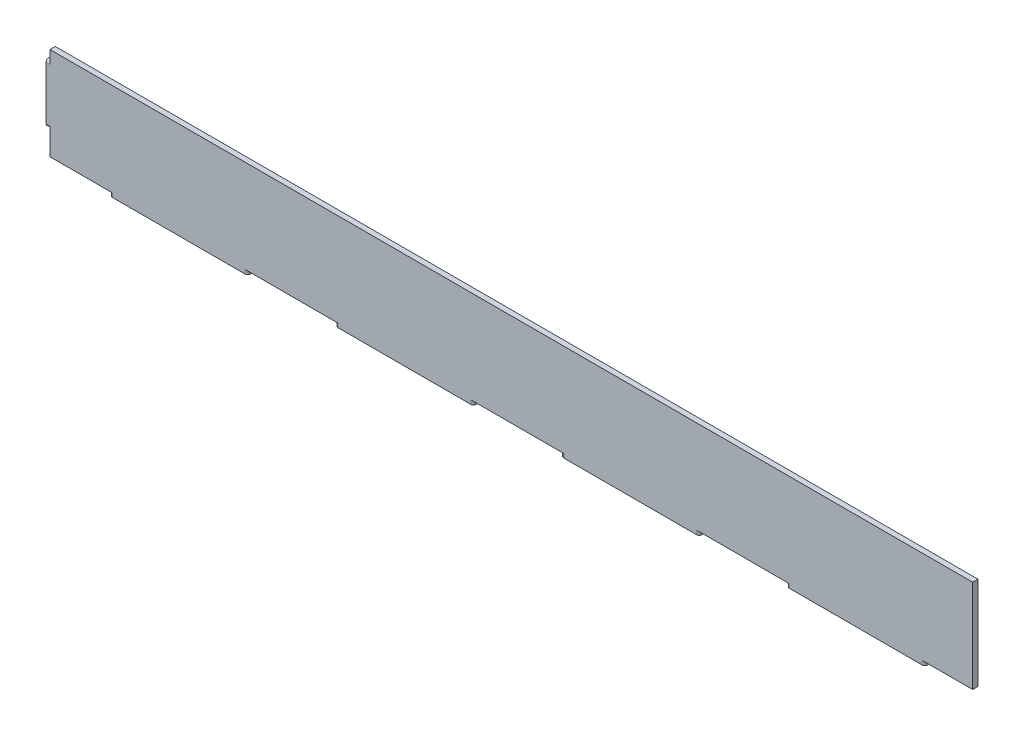
ISO-10303-21;
HEADER;
FILE_DESCRIPTION(('STEP AP214'),'2;1');
FILE_NAME('part.step','',(''),(''),'','','');
FILE_SCHEMA(('AUTOMOTIVE_DESIGN { 1 0 10303 214 1 1 1 1 }'));
ENDSEC;
DATA;
#1=APPLICATION_CONTEXT('core data for automotive mechanical design processes');
#2=APPLICATION_PROTOCOL_DEFINITION('international standard','automotive_design',2000,#1);
#3=PRODUCT_CONTEXT('',#1,'mechanical');
#4=PRODUCT('Part','Part','',(#3));
#5=PRODUCT_RELATED_PRODUCT_CATEGORY('part','',(#4));
#6=PRODUCT_DEFINITION_FORMATION('','',#4);
#7=PRODUCT_DEFINITION_CONTEXT('part definition',#1,'design');
#8=PRODUCT_DEFINITION('design','',#6,#7);
#9=PRODUCT_DEFINITION_SHAPE('','',#8);
#10=(LENGTH_UNIT() NAMED_UNIT(*) SI_UNIT(.MILLI.,.METRE.));
#11=(NAMED_UNIT(*) PLANE_ANGLE_UNIT() SI_UNIT($,.RADIAN.));
#12=(NAMED_UNIT(*) SI_UNIT($,.STERADIAN.) SOLID_ANGLE_UNIT());
#13=UNCERTAINTY_MEASURE_WITH_UNIT(LENGTH_MEASURE(1.E-05),#10,'distance_accuracy_value','');
#14=(GEOMETRIC_REPRESENTATION_CONTEXT(3) GLOBAL_UNCERTAINTY_ASSIGNED_CONTEXT((#13)) GLOBAL_UNIT_ASSIGNED_CONTEXT((#10,
#11,#12)) REPRESENTATION_CONTEXT('',''));
#15=CARTESIAN_POINT('',(0.,0.,0.));
#16=DIRECTION('',(0.,0.,1.));
#17=DIRECTION('',(1.,0.,0.));
#18=AXIS2_PLACEMENT_3D('',#15,#16,#17);
#19=CARTESIAN_POINT('',(0.,-40.1989336074635,4.));
#20=DIRECTION('',(1.,0.,0.));
#21=DIRECTION('',(0.,0.,-1.));
#22=AXIS2_PLACEMENT_3D('',#19,#20,#21);
#23=PLANE('',#22);
#24=CARTESIAN_POINT('',(0.,20.,2.));
#25=DIRECTION('',(-1.,0.,0.));
#26=DIRECTION('',(0.,0.,1.));
#27=AXIS2_PLACEMENT_3D('',#24,#25,#26);
#28=CIRCLE('',#27,2.);
#29=CARTESIAN_POINT('',(0.,20.,4.));
#30=VERTEX_POINT('',#29);
#31=CARTESIAN_POINT('',(0.,20.,0.));
#32=VERTEX_POINT('',#31);
#33=EDGE_CURVE('E50',#30,#32,#28,.T.);
#34=ORIENTED_EDGE('',*,*,#33,.F.);
#35=DIRECTION('',(0.,-1.,0.));
#36=VECTOR('',#35,1.);
#37=CARTESIAN_POINT('',(0.,-40.1989336074635,4.));
#38=LINE('',#37,#36);
#39=CARTESIAN_POINT('',(0.,29.8010663925365,4.));
#40=VERTEX_POINT('',#39);
#41=EDGE_CURVE('E333',#40,#30,#38,.T.);
#42=ORIENTED_EDGE('',*,*,#41,.F.);
#43=DIRECTION('',(0.,0.,-1.));
#44=VECTOR('',#43,1.);
#45=CARTESIAN_POINT('',(0.,29.8010663925365,4.));
#46=LINE('',#45,#44);
#47=CARTESIAN_POINT('',(0.,29.8010663925365,0.));
#48=VERTEX_POINT('',#47);
#49=EDGE_CURVE('E345',#40,#48,#46,.T.);
#50=ORIENTED_EDGE('',*,*,#49,.T.);
#51=DIRECTION('',(0.,-1.,0.));
#52=VECTOR('',#51,1.);
#53=CARTESIAN_POINT('',(0.,-40.1989336074635,0.));
#54=LINE('',#53,#52);
#55=EDGE_CURVE('E346',#48,#32,#54,.T.);
#56=ORIENTED_EDGE('',*,*,#55,.T.);
#57=EDGE_LOOP('',(#34,#42,#50,#56));
#58=FACE_BOUND('',#57,.T.);
#59=ADVANCED_FACE('F35',(#58),#23,.F.);
#60=CARTESIAN_POINT('',(0.,-40.1989336074635,4.));
#61=DIRECTION('',(0.,1.,0.));
#62=DIRECTION('',(0.,0.,1.));
#63=AXIS2_PLACEMENT_3D('',#60,#61,#62);
#64=PLANE('',#63);
#65=CARTESIAN_POINT('',(557.,-40.1989336074635,2.));
#66=DIRECTION('',(0.,-1.,0.));
#67=DIRECTION('',(0.,0.,-1.));
#68=AXIS2_PLACEMENT_3D('',#65,#66,#67);
#69=CIRCLE('',#68,1.99999999999998);
#70=CARTESIAN_POINT('',(557.,-40.1989336074635,4.));
#71=VERTEX_POINT('',#70);
#72=CARTESIAN_POINT('',(557.,-40.1989336074635,0.));
#73=VERTEX_POINT('',#72);
#74=EDGE_CURVE('E219',#71,#73,#69,.T.);
#75=ORIENTED_EDGE('',*,*,#74,.F.);
#76=DIRECTION('',(1.,0.,0.));
#77=VECTOR('',#76,1.);
#78=CARTESIAN_POINT('',(0.,-40.1989336074635,4.));
#79=LINE('',#78,#77);
#80=CARTESIAN_POINT('',(487.,-40.1989336074635,4.));
#81=VERTEX_POINT('',#80);
#82=EDGE_CURVE('E431',#81,#71,#79,.T.);
#83=ORIENTED_EDGE('',*,*,#82,.F.);
#84=CARTESIAN_POINT('',(487.,-40.1989336074635,1.99999999999998));
#85=DIRECTION('',(0.,-1.,0.));
#86=DIRECTION('',(0.,0.,-1.));
#87=AXIS2_PLACEMENT_3D('',#84,#85,#86);
#88=CIRCLE('',#87,1.99999999999998);
#89=CARTESIAN_POINT('',(487.,-40.1989336074635,0.));
#90=VERTEX_POINT('',#89);
#91=EDGE_CURVE('E256',#90,#81,#88,.T.);
#92=ORIENTED_EDGE('',*,*,#91,.F.);
#93=DIRECTION('',(1.,0.,0.));
#94=VECTOR('',#93,1.);
#95=CARTESIAN_POINT('',(0.,-40.1989336074635,0.));
#96=LINE('',#95,#94);
#97=EDGE_CURVE('E411',#90,#73,#96,.T.);
#98=ORIENTED_EDGE('',*,*,#97,.T.);
#99=EDGE_LOOP('',(#75,#83,#92,#98));
#100=FACE_BOUND('',#99,.T.);
#101=ADVANCED_FACE('F430',(#100),#64,.F.);
#102=CARTESIAN_POINT('',(657.,-40.1989336074635,1.99999999999998));
#103=DIRECTION('',(0.,-1.,0.));
#104=DIRECTION('',(0.,0.,-1.));
#105=AXIS2_PLACEMENT_3D('',#102,#103,#104);
#106=CIRCLE('',#105,1.99999999999998);
#107=CARTESIAN_POINT('',(657.,-40.1989336074635,0.));
#108=VERTEX_POINT('',#107);
#109=CARTESIAN_POINT('',(657.,-40.1989336074635,4.));
#110=VERTEX_POINT('',#109);
#111=EDGE_CURVE('E222',#108,#110,#106,.T.);
#112=ORIENTED_EDGE('',*,*,#111,.F.);
#113=CARTESIAN_POINT('',(695.,-40.1989336074635,0.));
#114=VERTEX_POINT('',#113);
#115=EDGE_CURVE('E348',#108,#114,#96,.T.);
#116=ORIENTED_EDGE('',*,*,#115,.T.);
#117=DIRECTION('',(0.,0.,-1.));
#118=VECTOR('',#117,1.);
#119=CARTESIAN_POINT('',(695.,-40.1989336074635,4.));
#120=LINE('',#119,#118);
#121=CARTESIAN_POINT('',(695.,-40.1989336074635,4.));
#122=VERTEX_POINT('',#121);
#123=EDGE_CURVE('E43',#122,#114,#120,.T.);
#124=ORIENTED_EDGE('',*,*,#123,.F.);
#125=EDGE_CURVE('E335',#110,#122,#79,.T.);
#126=ORIENTED_EDGE('',*,*,#125,.F.);
#127=EDGE_LOOP('',(#112,#116,#124,#126));
#128=FACE_BOUND('',#127,.T.);
#129=ADVANCED_FACE('F416',(#128),#64,.F.);
#130=CARTESIAN_POINT('',(387.,-40.1989336074635,2.));
#131=DIRECTION('',(0.,-1.,0.));
#132=DIRECTION('',(0.,0.,-1.));
#133=AXIS2_PLACEMENT_3D('',#130,#131,#132);
#134=CIRCLE('',#133,1.99999999999998);
#135=CARTESIAN_POINT('',(387.,-40.1989336074635,4.));
#136=VERTEX_POINT('',#135);
#137=CARTESIAN_POINT('',(387.,-40.1989336074635,0.));
#138=VERTEX_POINT('',#137);
#139=EDGE_CURVE('E251',#136,#138,#134,.T.);
#140=ORIENTED_EDGE('',*,*,#139,.F.);
#141=CARTESIAN_POINT('',(317.,-40.1989336074635,4.));
#142=VERTEX_POINT('',#141);
#143=EDGE_CURVE('E434',#142,#136,#79,.T.);
#144=ORIENTED_EDGE('',*,*,#143,.F.);
#145=CARTESIAN_POINT('',(317.,-40.1989336074635,1.99999999999998));
#146=DIRECTION('',(0.,-1.,0.));
#147=DIRECTION('',(0.,0.,-1.));
#148=AXIS2_PLACEMENT_3D('',#145,#146,#147);
#149=CIRCLE('',#148,1.99999999999998);
#150=CARTESIAN_POINT('',(317.,-40.1989336074635,0.));
#151=VERTEX_POINT('',#150);
#152=EDGE_CURVE('E283',#151,#142,#149,.T.);
#153=ORIENTED_EDGE('',*,*,#152,.F.);
#154=EDGE_CURVE('E410',#151,#138,#96,.T.);
#155=ORIENTED_EDGE('',*,*,#154,.T.);
#156=EDGE_LOOP('',(#140,#144,#153,#155));
#157=FACE_BOUND('',#156,.T.);
#158=ADVANCED_FACE('F449',(#157),#64,.F.);
#159=CARTESIAN_POINT('',(217.,-40.1989336074635,2.));
#160=DIRECTION('',(0.,-1.,0.));
#161=DIRECTION('',(0.,0.,-1.));
#162=AXIS2_PLACEMENT_3D('',#159,#160,#161);
#163=CIRCLE('',#162,1.99999999999998);
#164=CARTESIAN_POINT('',(217.,-40.1989336074635,4.));
#165=VERTEX_POINT('',#164);
#166=CARTESIAN_POINT('',(217.,-40.1989336074635,0.));
#167=VERTEX_POINT('',#166);
#168=EDGE_CURVE('E278',#165,#167,#163,.T.);
#169=ORIENTED_EDGE('',*,*,#168,.F.);
#170=CARTESIAN_POINT('',(147.,-40.1989336074635,3.99999999999998));
#171=VERTEX_POINT('',#170);
#172=EDGE_CURVE('E341',#171,#165,#79,.T.);
#173=ORIENTED_EDGE('',*,*,#172,.F.);
#174=CARTESIAN_POINT('',(147.,-40.1989336074635,1.99999999999998));
#175=DIRECTION('',(0.,-1.,0.));
#176=DIRECTION('',(0.,0.,-1.));
#177=AXIS2_PLACEMENT_3D('',#174,#175,#176);
#178=CIRCLE('',#177,1.99999999999998);
#179=CARTESIAN_POINT('',(147.,-40.1989336074635,0.));
#180=VERTEX_POINT('',#179);
#181=EDGE_CURVE('E310',#180,#171,#178,.T.);
#182=ORIENTED_EDGE('',*,*,#181,.F.);
#183=EDGE_CURVE('E352',#180,#167,#96,.T.);
#184=ORIENTED_EDGE('',*,*,#183,.T.);
#185=EDGE_LOOP('',(#169,#173,#182,#184));
#186=FACE_BOUND('',#185,.T.);
#187=ADVANCED_FACE('F408',(#186),#64,.F.);
#188=CARTESIAN_POINT('',(47.,-40.1989336074635,2.));
#189=DIRECTION('',(0.,-1.,0.));
#190=DIRECTION('',(0.,0.,-1.));
#191=AXIS2_PLACEMENT_3D('',#188,#189,#190);
#192=CIRCLE('',#191,1.99999999999998);
#193=CARTESIAN_POINT('',(47.,-40.1989336074635,4.));
#194=VERTEX_POINT('',#193);
#195=CARTESIAN_POINT('',(47.,-40.1989336074635,0.));
#196=VERTEX_POINT('',#195);
#197=EDGE_CURVE('E305',#194,#196,#192,.T.);
#198=ORIENTED_EDGE('',*,*,#197,.F.);
#199=CARTESIAN_POINT('',(0.,-40.1989336074635,4.));
#200=VERTEX_POINT('',#199);
#201=EDGE_CURVE('E337',#200,#194,#79,.T.);
#202=ORIENTED_EDGE('',*,*,#201,.F.);
#203=DIRECTION('',(0.,0.,-1.));
#204=VECTOR('',#203,1.);
#205=CARTESIAN_POINT('',(0.,-40.1989336074635,4.));
#206=LINE('',#205,#204);
#207=CARTESIAN_POINT('',(0.,-40.1989336074635,0.));
#208=VERTEX_POINT('',#207);
#209=EDGE_CURVE('E11',#200,#208,#206,.T.);
#210=ORIENTED_EDGE('',*,*,#209,.T.);
#211=EDGE_CURVE('E349',#208,#196,#96,.T.);
#212=ORIENTED_EDGE('',*,*,#211,.T.);
#213=EDGE_LOOP('',(#198,#202,#210,#212));
#214=FACE_BOUND('',#213,.T.);
#215=ADVANCED_FACE('F391',(#214),#64,.F.);
#216=CARTESIAN_POINT('',(0.,-20.,2.));
#217=DIRECTION('',(-1.,0.,0.));
#218=DIRECTION('',(0.,0.,1.));
#219=AXIS2_PLACEMENT_3D('',#216,#217,#218);
#220=CIRCLE('',#219,2.);
#221=CARTESIAN_POINT('',(0.,-20.,0.));
#222=VERTEX_POINT('',#221);
#223=CARTESIAN_POINT('',(0.,-20.,4.00000000000001));
#224=VERTEX_POINT('',#223);
#225=EDGE_CURVE('E58',#222,#224,#220,.T.);
#226=ORIENTED_EDGE('',*,*,#225,.F.);
#227=EDGE_CURVE('E332',#222,#208,#54,.T.);
#228=ORIENTED_EDGE('',*,*,#227,.T.);
#229=ORIENTED_EDGE('',*,*,#209,.F.);
#230=EDGE_CURVE('E336',#224,#200,#38,.T.);
#231=ORIENTED_EDGE('',*,*,#230,.F.);
#232=EDGE_LOOP('',(#226,#228,#229,#231));
#233=FACE_BOUND('',#232,.T.);
#234=ADVANCED_FACE('F37',(#233),#23,.F.);
#235=CARTESIAN_POINT('',(695.,-40.1989336074635,4.));
#236=DIRECTION('',(-1.,0.,0.));
#237=DIRECTION('',(0.,0.,1.));
#238=AXIS2_PLACEMENT_3D('',#235,#236,#237);
#239=PLANE('',#238);
#240=DIRECTION('',(0.,1.,0.));
#241=VECTOR('',#240,1.);
#242=CARTESIAN_POINT('',(695.,-40.1989336074635,0.));
#243=LINE('',#242,#241);
#244=CARTESIAN_POINT('',(695.,29.8010663925365,0.));
#245=VERTEX_POINT('',#244);
#246=EDGE_CURVE('E351',#114,#245,#243,.T.);
#247=ORIENTED_EDGE('',*,*,#246,.T.);
#248=DIRECTION('',(0.,0.,-1.));
#249=VECTOR('',#248,1.);
#250=CARTESIAN_POINT('',(695.,29.8010663925365,4.));
#251=LINE('',#250,#249);
#252=CARTESIAN_POINT('',(695.,29.8010663925365,4.));
#253=VERTEX_POINT('',#252);
#254=EDGE_CURVE('E358',#253,#245,#251,.T.);
#255=ORIENTED_EDGE('',*,*,#254,.F.);
#256=DIRECTION('',(0.,1.,0.));
#257=VECTOR('',#256,1.);
#258=CARTESIAN_POINT('',(695.,-40.1989336074635,4.));
#259=LINE('',#258,#257);
#260=EDGE_CURVE('E340',#122,#253,#259,.T.);
#261=ORIENTED_EDGE('',*,*,#260,.F.);
#262=ORIENTED_EDGE('',*,*,#123,.T.);
#263=EDGE_LOOP('',(#247,#255,#261,#262));
#264=FACE_BOUND('',#263,.T.);
#265=ADVANCED_FACE('F365',(#264),#239,.F.);
#266=CARTESIAN_POINT('',(0.,29.8010663925365,4.));
#267=DIRECTION('',(0.,-1.,0.));
#268=DIRECTION('',(0.,0.,-1.));
#269=AXIS2_PLACEMENT_3D('',#266,#267,#268);
#270=PLANE('',#269);
#271=DIRECTION('',(-1.,0.,0.));
#272=VECTOR('',#271,1.);
#273=CARTESIAN_POINT('',(0.,29.8010663925365,0.));
#274=LINE('',#273,#272);
#275=EDGE_CURVE('E354',#245,#48,#274,.T.);
#276=ORIENTED_EDGE('',*,*,#275,.T.);
#277=ORIENTED_EDGE('',*,*,#49,.F.);
#278=DIRECTION('',(-1.,0.,0.));
#279=VECTOR('',#278,1.);
#280=CARTESIAN_POINT('',(0.,29.8010663925365,4.));
#281=LINE('',#280,#279);
#282=EDGE_CURVE('E343',#253,#40,#281,.T.);
#283=ORIENTED_EDGE('',*,*,#282,.F.);
#284=ORIENTED_EDGE('',*,*,#254,.T.);
#285=EDGE_LOOP('',(#276,#277,#283,#284));
#286=FACE_BOUND('',#285,.T.);
#287=ADVANCED_FACE('F373',(#286),#270,.F.);
#288=CARTESIAN_POINT('',(0.,0.,4.));
#289=DIRECTION('',(0.,0.,-1.));
#290=DIRECTION('',(-1.,0.,0.));
#291=AXIS2_PLACEMENT_3D('',#288,#289,#290);
#292=PLANE('',#291);
#293=ORIENTED_EDGE('',*,*,#41,.T.);
#294=DIRECTION('',(1.,0.,0.));
#295=VECTOR('',#294,1.);
#296=CARTESIAN_POINT('',(-3.,20.,4.));
#297=LINE('',#296,#295);
#298=CARTESIAN_POINT('',(-3.,20.,4.));
#299=VERTEX_POINT('',#298);
#300=EDGE_CURVE('E377',#299,#30,#297,.T.);
#301=ORIENTED_EDGE('',*,*,#300,.F.);
#302=DIRECTION('',(0.,1.,0.));
#303=VECTOR('',#302,1.);
#304=CARTESIAN_POINT('',(-3.,20.,4.));
#305=LINE('',#304,#303);
#306=CARTESIAN_POINT('',(-3.,-20.,4.00000000000001));
#307=VERTEX_POINT('',#306);
#308=EDGE_CURVE('E213',#307,#299,#305,.T.);
#309=ORIENTED_EDGE('',*,*,#308,.F.);
#310=DIRECTION('',(1.,0.,0.));
#311=VECTOR('',#310,1.);
#312=CARTESIAN_POINT('',(-3.,-20.,4.00000000000001));
#313=LINE('',#312,#311);
#314=EDGE_CURVE('E224',#307,#224,#313,.T.);
#315=ORIENTED_EDGE('',*,*,#314,.T.);
#316=ORIENTED_EDGE('',*,*,#230,.T.);
#317=ORIENTED_EDGE('',*,*,#201,.T.);
#318=DIRECTION('',(0.,1.,0.));
#319=VECTOR('',#318,1.);
#320=CARTESIAN_POINT('',(47.,-43.1989336074635,3.99999999999998));
#321=LINE('',#320,#319);
#322=CARTESIAN_POINT('',(47.,-43.1989336074635,3.99999999999998));
#323=VERTEX_POINT('',#322);
#324=EDGE_CURVE('E316',#323,#194,#321,.T.);
#325=ORIENTED_EDGE('',*,*,#324,.F.);
#326=DIRECTION('',(-1.,0.,0.));
#327=VECTOR('',#326,1.);
#328=CARTESIAN_POINT('',(47.,-43.1989336074635,3.99999999999998));
#329=LINE('',#328,#327);
#330=CARTESIAN_POINT('',(147.,-43.1989336074635,3.99999999999998));
#331=VERTEX_POINT('',#330);
#332=EDGE_CURVE('E314',#331,#323,#329,.T.);
#333=ORIENTED_EDGE('',*,*,#332,.F.);
#334=DIRECTION('',(0.,1.,0.));
#335=VECTOR('',#334,1.);
#336=CARTESIAN_POINT('',(147.,-43.1989336074635,3.99999999999998));
#337=LINE('',#336,#335);
#338=EDGE_CURVE('E323',#331,#171,#337,.T.);
#339=ORIENTED_EDGE('',*,*,#338,.T.);
#340=ORIENTED_EDGE('',*,*,#172,.T.);
#341=DIRECTION('',(0.,1.,0.));
#342=VECTOR('',#341,1.);
#343=CARTESIAN_POINT('',(217.,-43.1989336074635,3.99999999999998));
#344=LINE('',#343,#342);
#345=CARTESIAN_POINT('',(217.,-43.1989336074635,3.99999999999998));
#346=VERTEX_POINT('',#345);
#347=EDGE_CURVE('E289',#346,#165,#344,.T.);
#348=ORIENTED_EDGE('',*,*,#347,.F.);
#349=DIRECTION('',(-1.,0.,0.));
#350=VECTOR('',#349,1.);
#351=CARTESIAN_POINT('',(217.,-43.1989336074635,3.99999999999998));
#352=LINE('',#351,#350);
#353=CARTESIAN_POINT('',(317.,-43.1989336074635,3.99999999999998));
#354=VERTEX_POINT('',#353);
#355=EDGE_CURVE('E287',#354,#346,#352,.T.);
#356=ORIENTED_EDGE('',*,*,#355,.F.);
#357=DIRECTION('',(0.,1.,0.));
#358=VECTOR('',#357,1.);
#359=CARTESIAN_POINT('',(317.,-43.1989336074635,3.99999999999998));
#360=LINE('',#359,#358);
#361=EDGE_CURVE('E296',#354,#142,#360,.T.);
#362=ORIENTED_EDGE('',*,*,#361,.T.);
#363=ORIENTED_EDGE('',*,*,#143,.T.);
#364=DIRECTION('',(0.,1.,0.));
#365=VECTOR('',#364,1.);
#366=CARTESIAN_POINT('',(387.,-43.1989336074635,3.99999999999998));
#367=LINE('',#366,#365);
#368=CARTESIAN_POINT('',(387.,-43.1989336074635,3.99999999999998));
#369=VERTEX_POINT('',#368);
#370=EDGE_CURVE('E262',#369,#136,#367,.T.);
#371=ORIENTED_EDGE('',*,*,#370,.F.);
#372=DIRECTION('',(-1.,0.,0.));
#373=VECTOR('',#372,1.);
#374=CARTESIAN_POINT('',(387.,-43.1989336074635,3.99999999999998));
#375=LINE('',#374,#373);
#376=CARTESIAN_POINT('',(487.,-43.1989336074635,3.99999999999998));
#377=VERTEX_POINT('',#376);
#378=EDGE_CURVE('E260',#377,#369,#375,.T.);
#379=ORIENTED_EDGE('',*,*,#378,.F.);
#380=DIRECTION('',(0.,1.,0.));
#381=VECTOR('',#380,1.);
#382=CARTESIAN_POINT('',(487.,-43.1989336074635,3.99999999999998));
#383=LINE('',#382,#381);
#384=EDGE_CURVE('E269',#377,#81,#383,.T.);
#385=ORIENTED_EDGE('',*,*,#384,.T.);
#386=ORIENTED_EDGE('',*,*,#82,.T.);
#387=DIRECTION('',(0.,1.,0.));
#388=VECTOR('',#387,1.);
#389=CARTESIAN_POINT('',(557.,-43.1989336074635,3.99999999999998));
#390=LINE('',#389,#388);
#391=CARTESIAN_POINT('',(557.,-43.1989336074635,3.99999999999998));
#392=VERTEX_POINT('',#391);
#393=EDGE_CURVE('E236',#392,#71,#390,.T.);
#394=ORIENTED_EDGE('',*,*,#393,.F.);
#395=DIRECTION('',(-1.,0.,0.));
#396=VECTOR('',#395,1.);
#397=CARTESIAN_POINT('',(557.,-43.1989336074635,3.99999999999998));
#398=LINE('',#397,#396);
#399=CARTESIAN_POINT('',(657.,-43.1989336074635,3.99999999999998));
#400=VERTEX_POINT('',#399);
#401=EDGE_CURVE('E235',#400,#392,#398,.T.);
#402=ORIENTED_EDGE('',*,*,#401,.F.);
#403=DIRECTION('',(0.,1.,0.));
#404=VECTOR('',#403,1.);
#405=CARTESIAN_POINT('',(657.,-43.1989336074635,3.99999999999998));
#406=LINE('',#405,#404);
#407=EDGE_CURVE('E242',#400,#110,#406,.T.);
#408=ORIENTED_EDGE('',*,*,#407,.T.);
#409=ORIENTED_EDGE('',*,*,#125,.T.);
#410=ORIENTED_EDGE('',*,*,#260,.T.);
#411=ORIENTED_EDGE('',*,*,#282,.T.);
#412=EDGE_LOOP('',(#293,#301,#309,#315,#316,#317,#325,#333,#339,#340,#348,#356,#362,#363,#371,
#379,#385,#386,#394,#402,#408,#409,#410,#411));
#413=FACE_BOUND('',#412,.T.);
#414=ADVANCED_FACE('F376',(#413),#292,.F.);
#415=CARTESIAN_POINT('',(0.,0.,0.));
#416=DIRECTION('',(0.,0.,-1.));
#417=DIRECTION('',(-1.,0.,0.));
#418=AXIS2_PLACEMENT_3D('',#415,#416,#417);
#419=PLANE('',#418);
#420=ORIENTED_EDGE('',*,*,#55,.F.);
#421=ORIENTED_EDGE('',*,*,#275,.F.);
#422=ORIENTED_EDGE('',*,*,#246,.F.);
#423=ORIENTED_EDGE('',*,*,#115,.F.);
#424=DIRECTION('',(0.,1.,0.));
#425=VECTOR('',#424,1.);
#426=CARTESIAN_POINT('',(657.,-43.1989336074635,0.));
#427=LINE('',#426,#425);
#428=CARTESIAN_POINT('',(657.,-43.1989336074635,0.));
#429=VERTEX_POINT('',#428);
#430=EDGE_CURVE('E245',#429,#108,#427,.T.);
#431=ORIENTED_EDGE('',*,*,#430,.F.);
#432=DIRECTION('',(1.,0.,0.));
#433=VECTOR('',#432,1.);
#434=CARTESIAN_POINT('',(557.,-43.1989336074635,0.));
#435=LINE('',#434,#433);
#436=CARTESIAN_POINT('',(557.,-43.1989336074635,0.));
#437=VERTEX_POINT('',#436);
#438=EDGE_CURVE('E231',#437,#429,#435,.T.);
#439=ORIENTED_EDGE('',*,*,#438,.F.);
#440=DIRECTION('',(0.,1.,0.));
#441=VECTOR('',#440,1.);
#442=CARTESIAN_POINT('',(557.,-43.1989336074635,0.));
#443=LINE('',#442,#441);
#444=EDGE_CURVE('E248',#437,#73,#443,.T.);
#445=ORIENTED_EDGE('',*,*,#444,.T.);
#446=ORIENTED_EDGE('',*,*,#97,.F.);
#447=DIRECTION('',(0.,1.,0.));
#448=VECTOR('',#447,1.);
#449=CARTESIAN_POINT('',(487.,-43.1989336074635,0.));
#450=LINE('',#449,#448);
#451=CARTESIAN_POINT('',(487.,-43.1989336074635,0.));
#452=VERTEX_POINT('',#451);
#453=EDGE_CURVE('E272',#452,#90,#450,.T.);
#454=ORIENTED_EDGE('',*,*,#453,.F.);
#455=DIRECTION('',(1.,0.,0.));
#456=VECTOR('',#455,1.);
#457=CARTESIAN_POINT('',(387.,-43.1989336074635,0.));
#458=LINE('',#457,#456);
#459=CARTESIAN_POINT('',(387.,-43.1989336074635,0.));
#460=VERTEX_POINT('',#459);
#461=EDGE_CURVE('E255',#460,#452,#458,.T.);
#462=ORIENTED_EDGE('',*,*,#461,.F.);
#463=DIRECTION('',(0.,1.,0.));
#464=VECTOR('',#463,1.);
#465=CARTESIAN_POINT('',(387.,-43.1989336074635,0.));
#466=LINE('',#465,#464);
#467=EDGE_CURVE('E275',#460,#138,#466,.T.);
#468=ORIENTED_EDGE('',*,*,#467,.T.);
#469=ORIENTED_EDGE('',*,*,#154,.F.);
#470=DIRECTION('',(0.,1.,0.));
#471=VECTOR('',#470,1.);
#472=CARTESIAN_POINT('',(317.,-43.1989336074635,0.));
#473=LINE('',#472,#471);
#474=CARTESIAN_POINT('',(317.,-43.1989336074635,0.));
#475=VERTEX_POINT('',#474);
#476=EDGE_CURVE('E299',#475,#151,#473,.T.);
#477=ORIENTED_EDGE('',*,*,#476,.F.);
#478=DIRECTION('',(1.,0.,0.));
#479=VECTOR('',#478,1.);
#480=CARTESIAN_POINT('',(217.,-43.1989336074635,0.));
#481=LINE('',#480,#479);
#482=CARTESIAN_POINT('',(217.,-43.1989336074635,0.));
#483=VERTEX_POINT('',#482);
#484=EDGE_CURVE('E282',#483,#475,#481,.T.);
#485=ORIENTED_EDGE('',*,*,#484,.F.);
#486=DIRECTION('',(0.,1.,0.));
#487=VECTOR('',#486,1.);
#488=CARTESIAN_POINT('',(217.,-43.1989336074635,0.));
#489=LINE('',#488,#487);
#490=EDGE_CURVE('E302',#483,#167,#489,.T.);
#491=ORIENTED_EDGE('',*,*,#490,.T.);
#492=ORIENTED_EDGE('',*,*,#183,.F.);
#493=DIRECTION('',(0.,1.,0.));
#494=VECTOR('',#493,1.);
#495=CARTESIAN_POINT('',(147.,-43.1989336074635,0.));
#496=LINE('',#495,#494);
#497=CARTESIAN_POINT('',(147.,-43.1989336074635,0.));
#498=VERTEX_POINT('',#497);
#499=EDGE_CURVE('E326',#498,#180,#496,.T.);
#500=ORIENTED_EDGE('',*,*,#499,.F.);
#501=DIRECTION('',(1.,0.,0.));
#502=VECTOR('',#501,1.);
#503=CARTESIAN_POINT('',(47.,-43.1989336074635,0.));
#504=LINE('',#503,#502);
#505=CARTESIAN_POINT('',(47.,-43.1989336074635,0.));
#506=VERTEX_POINT('',#505);
#507=EDGE_CURVE('E309',#506,#498,#504,.T.);
#508=ORIENTED_EDGE('',*,*,#507,.F.);
#509=DIRECTION('',(0.,1.,0.));
#510=VECTOR('',#509,1.);
#511=CARTESIAN_POINT('',(47.,-43.1989336074635,0.));
#512=LINE('',#511,#510);
#513=EDGE_CURVE('E329',#506,#196,#512,.T.);
#514=ORIENTED_EDGE('',*,*,#513,.T.);
#515=ORIENTED_EDGE('',*,*,#211,.F.);
#516=ORIENTED_EDGE('',*,*,#227,.F.);
#517=DIRECTION('',(1.,0.,0.));
#518=VECTOR('',#517,1.);
#519=CARTESIAN_POINT('',(-3.,-20.,0.));
#520=LINE('',#519,#518);
#521=CARTESIAN_POINT('',(-3.,-20.,0.));
#522=VERTEX_POINT('',#521);
#523=EDGE_CURVE('E204',#522,#222,#520,.T.);
#524=ORIENTED_EDGE('',*,*,#523,.F.);
#525=DIRECTION('',(0.,-1.,0.));
#526=VECTOR('',#525,1.);
#527=CARTESIAN_POINT('',(-3.,20.,0.));
#528=LINE('',#527,#526);
#529=CARTESIAN_POINT('',(-3.,20.,0.));
#530=VERTEX_POINT('',#529);
#531=EDGE_CURVE('E197',#530,#522,#528,.T.);
#532=ORIENTED_EDGE('',*,*,#531,.F.);
#533=DIRECTION('',(1.,0.,0.));
#534=VECTOR('',#533,1.);
#535=CARTESIAN_POINT('',(-3.,20.,0.));
#536=LINE('',#535,#534);
#537=EDGE_CURVE('E202',#530,#32,#536,.T.);
#538=ORIENTED_EDGE('',*,*,#537,.T.);
#539=EDGE_LOOP('',(#420,#421,#422,#423,#431,#439,#445,#446,#454,#462,#468,#469,#477,#485,#491,
#492,#500,#508,#514,#515,#516,#524,#532,#538));
#540=FACE_BOUND('',#539,.T.);
#541=ADVANCED_FACE('F200',(#540),#419,.T.);
#542=CARTESIAN_POINT('',(47.,-43.1989336074635,2.));
#543=DIRECTION('',(0.,1.,0.));
#544=DIRECTION('',(0.,0.,1.));
#545=AXIS2_PLACEMENT_3D('',#542,#543,#544);
#546=CYLINDRICAL_SURFACE('',#545,1.99999999999998);
#547=ORIENTED_EDGE('',*,*,#197,.T.);
#548=ORIENTED_EDGE('',*,*,#513,.F.);
#549=CARTESIAN_POINT('',(47.,-43.1989336074635,2.));
#550=DIRECTION('',(0.,-1.,0.));
#551=DIRECTION('',(0.,0.,-1.));
#552=AXIS2_PLACEMENT_3D('',#549,#550,#551);
#553=CIRCLE('',#552,1.99999999999998);
#554=EDGE_CURVE('E306',#323,#506,#553,.T.);
#555=ORIENTED_EDGE('',*,*,#554,.F.);
#556=ORIENTED_EDGE('',*,*,#324,.T.);
#557=EDGE_LOOP('',(#547,#548,#555,#556));
#558=FACE_BOUND('',#557,.T.);
#559=ADVANCED_FACE('F397',(#558),#546,.T.);
#560=CARTESIAN_POINT('',(147.,-43.1989336074635,1.99999999999998));
#561=DIRECTION('',(0.,1.,0.));
#562=DIRECTION('',(0.,0.,1.));
#563=AXIS2_PLACEMENT_3D('',#560,#561,#562);
#564=CYLINDRICAL_SURFACE('',#563,1.99999999999998);
#565=ORIENTED_EDGE('',*,*,#181,.T.);
#566=ORIENTED_EDGE('',*,*,#338,.F.);
#567=CARTESIAN_POINT('',(147.,-43.1989336074635,1.99999999999998));
#568=DIRECTION('',(0.,-1.,0.));
#569=DIRECTION('',(0.,0.,-1.));
#570=AXIS2_PLACEMENT_3D('',#567,#568,#569);
#571=CIRCLE('',#570,1.99999999999998);
#572=EDGE_CURVE('E312',#498,#331,#571,.T.);
#573=ORIENTED_EDGE('',*,*,#572,.F.);
#574=ORIENTED_EDGE('',*,*,#499,.T.);
#575=EDGE_LOOP('',(#565,#566,#573,#574));
#576=FACE_BOUND('',#575,.T.);
#577=ADVANCED_FACE('F405',(#576),#564,.T.);
#578=CARTESIAN_POINT('',(47.,-43.1989336074635,2.));
#579=DIRECTION('',(0.,-1.,0.));
#580=DIRECTION('',(0.,0.,-1.));
#581=AXIS2_PLACEMENT_3D('',#578,#579,#580);
#582=PLANE('',#581);
#583=ORIENTED_EDGE('',*,*,#554,.T.);
#584=ORIENTED_EDGE('',*,*,#507,.T.);
#585=ORIENTED_EDGE('',*,*,#572,.T.);
#586=ORIENTED_EDGE('',*,*,#332,.T.);
#587=EDGE_LOOP('',(#583,#584,#585,#586));
#588=FACE_BOUND('',#587,.T.);
#589=ADVANCED_FACE('F402',(#588),#582,.T.);
#590=CARTESIAN_POINT('',(217.,-43.1989336074635,2.));
#591=DIRECTION('',(0.,1.,0.));
#592=DIRECTION('',(0.,0.,1.));
#593=AXIS2_PLACEMENT_3D('',#590,#591,#592);
#594=CYLINDRICAL_SURFACE('',#593,1.99999999999998);
#595=ORIENTED_EDGE('',*,*,#168,.T.);
#596=ORIENTED_EDGE('',*,*,#490,.F.);
#597=CARTESIAN_POINT('',(217.,-43.1989336074635,2.));
#598=DIRECTION('',(0.,-1.,0.));
#599=DIRECTION('',(0.,0.,-1.));
#600=AXIS2_PLACEMENT_3D('',#597,#598,#599);
#601=CIRCLE('',#600,1.99999999999998);
#602=EDGE_CURVE('E279',#346,#483,#601,.T.);
#603=ORIENTED_EDGE('',*,*,#602,.F.);
#604=ORIENTED_EDGE('',*,*,#347,.T.);
#605=EDGE_LOOP('',(#595,#596,#603,#604));
#606=FACE_BOUND('',#605,.T.);
#607=ADVANCED_FACE('F441',(#606),#594,.T.);
#608=CARTESIAN_POINT('',(317.,-43.1989336074635,1.99999999999998));
#609=DIRECTION('',(0.,1.,0.));
#610=DIRECTION('',(0.,0.,1.));
#611=AXIS2_PLACEMENT_3D('',#608,#609,#610);
#612=CYLINDRICAL_SURFACE('',#611,1.99999999999998);
#613=ORIENTED_EDGE('',*,*,#152,.T.);
#614=ORIENTED_EDGE('',*,*,#361,.F.);
#615=CARTESIAN_POINT('',(317.,-43.1989336074635,1.99999999999998));
#616=DIRECTION('',(0.,-1.,0.));
#617=DIRECTION('',(0.,0.,-1.));
#618=AXIS2_PLACEMENT_3D('',#615,#616,#617);
#619=CIRCLE('',#618,1.99999999999998);
#620=EDGE_CURVE('E285',#475,#354,#619,.T.);
#621=ORIENTED_EDGE('',*,*,#620,.F.);
#622=ORIENTED_EDGE('',*,*,#476,.T.);
#623=EDGE_LOOP('',(#613,#614,#621,#622));
#624=FACE_BOUND('',#623,.T.);
#625=ADVANCED_FACE('F448',(#624),#612,.T.);
#626=CARTESIAN_POINT('',(217.,-43.1989336074635,2.));
#627=DIRECTION('',(0.,-1.,0.));
#628=DIRECTION('',(0.,0.,-1.));
#629=AXIS2_PLACEMENT_3D('',#626,#627,#628);
#630=PLANE('',#629);
#631=ORIENTED_EDGE('',*,*,#602,.T.);
#632=ORIENTED_EDGE('',*,*,#484,.T.);
#633=ORIENTED_EDGE('',*,*,#620,.T.);
#634=ORIENTED_EDGE('',*,*,#355,.T.);
#635=EDGE_LOOP('',(#631,#632,#633,#634));
#636=FACE_BOUND('',#635,.T.);
#637=ADVANCED_FACE('F443',(#636),#630,.T.);
#638=CARTESIAN_POINT('',(387.,-43.1989336074635,2.));
#639=DIRECTION('',(0.,1.,0.));
#640=DIRECTION('',(0.,0.,1.));
#641=AXIS2_PLACEMENT_3D('',#638,#639,#640);
#642=CYLINDRICAL_SURFACE('',#641,1.99999999999998);
#643=ORIENTED_EDGE('',*,*,#139,.T.);
#644=ORIENTED_EDGE('',*,*,#467,.F.);
#645=CARTESIAN_POINT('',(387.,-43.1989336074635,2.));
#646=DIRECTION('',(0.,-1.,0.));
#647=DIRECTION('',(0.,0.,-1.));
#648=AXIS2_PLACEMENT_3D('',#645,#646,#647);
#649=CIRCLE('',#648,1.99999999999998);
#650=EDGE_CURVE('E252',#369,#460,#649,.T.);
#651=ORIENTED_EDGE('',*,*,#650,.F.);
#652=ORIENTED_EDGE('',*,*,#370,.T.);
#653=EDGE_LOOP('',(#643,#644,#651,#652));
#654=FACE_BOUND('',#653,.T.);
#655=ADVANCED_FACE('F452',(#654),#642,.T.);
#656=CARTESIAN_POINT('',(487.,-43.1989336074635,1.99999999999998));
#657=DIRECTION('',(0.,1.,0.));
#658=DIRECTION('',(0.,0.,1.));
#659=AXIS2_PLACEMENT_3D('',#656,#657,#658);
#660=CYLINDRICAL_SURFACE('',#659,1.99999999999998);
#661=ORIENTED_EDGE('',*,*,#91,.T.);
#662=ORIENTED_EDGE('',*,*,#384,.F.);
#663=CARTESIAN_POINT('',(487.,-43.1989336074635,1.99999999999998));
#664=DIRECTION('',(0.,-1.,0.));
#665=DIRECTION('',(0.,0.,-1.));
#666=AXIS2_PLACEMENT_3D('',#663,#664,#665);
#667=CIRCLE('',#666,1.99999999999998);
#668=EDGE_CURVE('E258',#452,#377,#667,.T.);
#669=ORIENTED_EDGE('',*,*,#668,.F.);
#670=ORIENTED_EDGE('',*,*,#453,.T.);
#671=EDGE_LOOP('',(#661,#662,#669,#670));
#672=FACE_BOUND('',#671,.T.);
#673=ADVANCED_FACE('F459',(#672),#660,.T.);
#674=CARTESIAN_POINT('',(387.,-43.1989336074635,2.));
#675=DIRECTION('',(0.,-1.,0.));
#676=DIRECTION('',(0.,0.,-1.));
#677=AXIS2_PLACEMENT_3D('',#674,#675,#676);
#678=PLANE('',#677);
#679=ORIENTED_EDGE('',*,*,#650,.T.);
#680=ORIENTED_EDGE('',*,*,#461,.T.);
#681=ORIENTED_EDGE('',*,*,#668,.T.);
#682=ORIENTED_EDGE('',*,*,#378,.T.);
#683=EDGE_LOOP('',(#679,#680,#681,#682));
#684=FACE_BOUND('',#683,.T.);
#685=ADVANCED_FACE('F455',(#684),#678,.T.);
#686=CARTESIAN_POINT('',(557.,-43.1989336074635,2.));
#687=DIRECTION('',(0.,1.,0.));
#688=DIRECTION('',(0.,0.,1.));
#689=AXIS2_PLACEMENT_3D('',#686,#687,#688);
#690=CYLINDRICAL_SURFACE('',#689,1.99999999999998);
#691=ORIENTED_EDGE('',*,*,#74,.T.);
#692=ORIENTED_EDGE('',*,*,#444,.F.);
#693=CARTESIAN_POINT('',(557.,-43.1989336074635,2.));
#694=DIRECTION('',(0.,-1.,0.));
#695=DIRECTION('',(0.,0.,-1.));
#696=AXIS2_PLACEMENT_3D('',#693,#694,#695);
#697=CIRCLE('',#696,1.99999999999998);
#698=EDGE_CURVE('E228',#392,#437,#697,.T.);
#699=ORIENTED_EDGE('',*,*,#698,.F.);
#700=ORIENTED_EDGE('',*,*,#393,.T.);
#701=EDGE_LOOP('',(#691,#692,#699,#700));
#702=FACE_BOUND('',#701,.T.);
#703=ADVANCED_FACE('F428',(#702),#690,.T.);
#704=CARTESIAN_POINT('',(657.,-43.1989336074635,1.99999999999998));
#705=DIRECTION('',(0.,1.,0.));
#706=DIRECTION('',(0.,0.,1.));
#707=AXIS2_PLACEMENT_3D('',#704,#705,#706);
#708=CYLINDRICAL_SURFACE('',#707,1.99999999999998);
#709=ORIENTED_EDGE('',*,*,#111,.T.);
#710=ORIENTED_EDGE('',*,*,#407,.F.);
#711=CARTESIAN_POINT('',(657.,-43.1989336074635,1.99999999999998));
#712=DIRECTION('',(0.,-1.,0.));
#713=DIRECTION('',(0.,0.,-1.));
#714=AXIS2_PLACEMENT_3D('',#711,#712,#713);
#715=CIRCLE('',#714,1.99999999999998);
#716=EDGE_CURVE('E233',#429,#400,#715,.T.);
#717=ORIENTED_EDGE('',*,*,#716,.F.);
#718=ORIENTED_EDGE('',*,*,#430,.T.);
#719=EDGE_LOOP('',(#709,#710,#717,#718));
#720=FACE_BOUND('',#719,.T.);
#721=ADVANCED_FACE('F420',(#720),#708,.T.);
#722=CARTESIAN_POINT('',(557.,-43.1989336074635,2.));
#723=DIRECTION('',(0.,-1.,0.));
#724=DIRECTION('',(0.,0.,-1.));
#725=AXIS2_PLACEMENT_3D('',#722,#723,#724);
#726=PLANE('',#725);
#727=ORIENTED_EDGE('',*,*,#698,.T.);
#728=ORIENTED_EDGE('',*,*,#438,.T.);
#729=ORIENTED_EDGE('',*,*,#716,.T.);
#730=ORIENTED_EDGE('',*,*,#401,.T.);
#731=EDGE_LOOP('',(#727,#728,#729,#730));
#732=FACE_BOUND('',#731,.T.);
#733=ADVANCED_FACE('F424',(#732),#726,.T.);
#734=CARTESIAN_POINT('',(-3.,20.,2.));
#735=DIRECTION('',(1.,0.,0.));
#736=DIRECTION('',(0.,0.,-1.));
#737=AXIS2_PLACEMENT_3D('',#734,#735,#736);
#738=CYLINDRICAL_SURFACE('',#737,2.);
#739=ORIENTED_EDGE('',*,*,#33,.T.);
#740=ORIENTED_EDGE('',*,*,#537,.F.);
#741=CARTESIAN_POINT('',(-3.,20.,2.));
#742=DIRECTION('',(-1.,0.,0.));
#743=DIRECTION('',(0.,0.,1.));
#744=AXIS2_PLACEMENT_3D('',#741,#742,#743);
#745=CIRCLE('',#744,2.);
#746=EDGE_CURVE('E208',#299,#530,#745,.T.);
#747=ORIENTED_EDGE('',*,*,#746,.F.);
#748=ORIENTED_EDGE('',*,*,#300,.T.);
#749=EDGE_LOOP('',(#739,#740,#747,#748));
#750=FACE_BOUND('',#749,.T.);
#751=ADVANCED_FACE('F218',(#750),#738,.T.);
#752=CARTESIAN_POINT('',(-3.,-20.,2.));
#753=DIRECTION('',(1.,0.,0.));
#754=DIRECTION('',(0.,0.,-1.));
#755=AXIS2_PLACEMENT_3D('',#752,#753,#754);
#756=CYLINDRICAL_SURFACE('',#755,2.);
#757=ORIENTED_EDGE('',*,*,#225,.T.);
#758=ORIENTED_EDGE('',*,*,#314,.F.);
#759=CARTESIAN_POINT('',(-3.,-20.,2.));
#760=DIRECTION('',(-1.,0.,0.));
#761=DIRECTION('',(0.,0.,1.));
#762=AXIS2_PLACEMENT_3D('',#759,#760,#761);
#763=CIRCLE('',#762,2.);
#764=EDGE_CURVE('E207',#522,#307,#763,.T.);
#765=ORIENTED_EDGE('',*,*,#764,.F.);
#766=ORIENTED_EDGE('',*,*,#523,.T.);
#767=EDGE_LOOP('',(#757,#758,#765,#766));
#768=FACE_BOUND('',#767,.T.);
#769=ADVANCED_FACE('F386',(#768),#756,.T.);
#770=CARTESIAN_POINT('',(-3.,20.,2.));
#771=DIRECTION('',(-1.,0.,0.));
#772=DIRECTION('',(0.,0.,1.));
#773=AXIS2_PLACEMENT_3D('',#770,#771,#772);
#774=PLANE('',#773);
#775=ORIENTED_EDGE('',*,*,#746,.T.);
#776=ORIENTED_EDGE('',*,*,#531,.T.);
#777=ORIENTED_EDGE('',*,*,#764,.T.);
#778=ORIENTED_EDGE('',*,*,#308,.T.);
#779=EDGE_LOOP('',(#775,#776,#777,#778));
#780=FACE_BOUND('',#779,.T.);
#781=ADVANCED_FACE('F211',(#780),#774,.T.);
#782=CLOSED_SHELL('',(#59,#101,#129,#158,#187,#215,#234,#265,#287,#414,#541,#559,#577,#589,#607,
#625,#637,#655,#673,#685,#703,#721,#733,#751,#769,#781));
#783=MANIFOLD_SOLID_BREP('B2',#782);
#784=ADVANCED_BREP_SHAPE_REPRESENTATION('',(#18,#783),#14);
#785=SHAPE_DEFINITION_REPRESENTATION(#9,#784);
ENDSEC;
END-ISO-10303-21;
